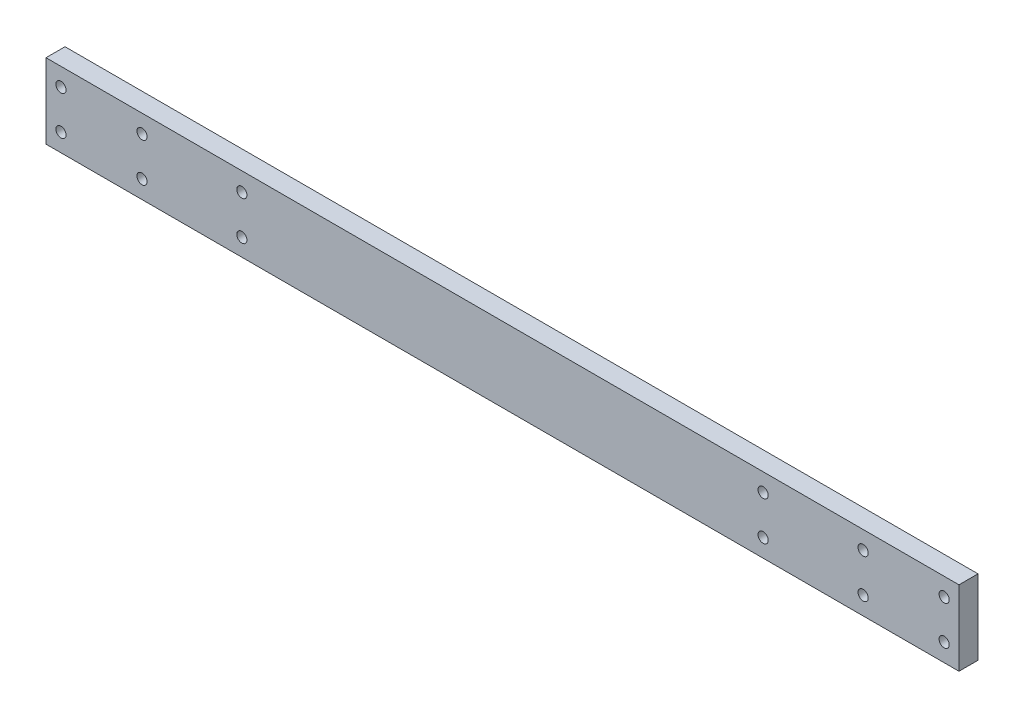
ISO-10303-21;
HEADER;
FILE_DESCRIPTION(('STEP AP214'),'2;1');
FILE_NAME('part.step','',(''),(''),'','','');
FILE_SCHEMA(('AUTOMOTIVE_DESIGN { 1 0 10303 214 1 1 1 1 }'));
ENDSEC;
DATA;
#1=APPLICATION_CONTEXT('core data for automotive mechanical design processes');
#2=APPLICATION_PROTOCOL_DEFINITION('international standard','automotive_design',2000,#1);
#3=PRODUCT_CONTEXT('',#1,'mechanical');
#4=PRODUCT('Part','Part','',(#3));
#5=PRODUCT_RELATED_PRODUCT_CATEGORY('part','',(#4));
#6=PRODUCT_DEFINITION_FORMATION('','',#4);
#7=PRODUCT_DEFINITION_CONTEXT('part definition',#1,'design');
#8=PRODUCT_DEFINITION('design','',#6,#7);
#9=PRODUCT_DEFINITION_SHAPE('','',#8);
#10=(LENGTH_UNIT() NAMED_UNIT(*) SI_UNIT(.MILLI.,.METRE.));
#11=(NAMED_UNIT(*) PLANE_ANGLE_UNIT() SI_UNIT($,.RADIAN.));
#12=(NAMED_UNIT(*) SI_UNIT($,.STERADIAN.) SOLID_ANGLE_UNIT());
#13=UNCERTAINTY_MEASURE_WITH_UNIT(LENGTH_MEASURE(1.E-05),#10,'distance_accuracy_value','');
#14=(GEOMETRIC_REPRESENTATION_CONTEXT(3) GLOBAL_UNCERTAINTY_ASSIGNED_CONTEXT((#13)) GLOBAL_UNIT_ASSIGNED_CONTEXT((#10,
#11,#12)) REPRESENTATION_CONTEXT('',''));
#15=CARTESIAN_POINT('',(0.,0.,0.));
#16=DIRECTION('',(0.,0.,1.));
#17=DIRECTION('',(1.,0.,0.));
#18=AXIS2_PLACEMENT_3D('',#15,#16,#17);
#19=CARTESIAN_POINT('',(264.023766162715,0.,6.35));
#20=DIRECTION('',(1.,0.,0.));
#21=DIRECTION('',(0.,0.,-1.));
#22=AXIS2_PLACEMENT_3D('',#19,#20,#21);
#23=PLANE('',#22);
#24=DIRECTION('',(0.,-1.,0.));
#25=VECTOR('',#24,1.);
#26=CARTESIAN_POINT('',(264.023766162715,0.,0.));
#27=LINE('',#26,#25);
#28=CARTESIAN_POINT('',(264.023766162715,235.923622409626,0.));
#29=VERTEX_POINT('',#28);
#30=CARTESIAN_POINT('',(264.023766162715,210.923622409626,0.));
#31=VERTEX_POINT('',#30);
#32=EDGE_CURVE('E103',#29,#31,#27,.T.);
#33=ORIENTED_EDGE('',*,*,#32,.F.);
#34=DIRECTION('',(0.,0.,-1.));
#35=VECTOR('',#34,1.);
#36=CARTESIAN_POINT('',(264.023766162715,235.923622409626,6.35));
#37=LINE('',#36,#35);
#38=CARTESIAN_POINT('',(264.023766162715,235.923622409626,6.35));
#39=VERTEX_POINT('',#38);
#40=EDGE_CURVE('E11',#39,#29,#37,.T.);
#41=ORIENTED_EDGE('',*,*,#40,.F.);
#42=DIRECTION('',(0.,-1.,0.));
#43=VECTOR('',#42,1.);
#44=CARTESIAN_POINT('',(264.023766162715,0.,6.35));
#45=LINE('',#44,#43);
#46=CARTESIAN_POINT('',(264.023766162715,210.923622409626,6.35));
#47=VERTEX_POINT('',#46);
#48=EDGE_CURVE('E96',#39,#47,#45,.T.);
#49=ORIENTED_EDGE('',*,*,#48,.T.);
#50=DIRECTION('',(0.,0.,-1.));
#51=VECTOR('',#50,1.);
#52=CARTESIAN_POINT('',(264.023766162715,210.923622409626,6.35));
#53=LINE('',#52,#51);
#54=EDGE_CURVE('E76',#47,#31,#53,.T.);
#55=ORIENTED_EDGE('',*,*,#54,.T.);
#56=EDGE_LOOP('',(#33,#41,#49,#55));
#57=FACE_BOUND('',#56,.T.);
#58=ADVANCED_FACE('F36',(#57),#23,.T.);
#59=CARTESIAN_POINT('',(0.,235.923622409626,6.35));
#60=DIRECTION('',(0.,1.,0.));
#61=DIRECTION('',(0.,0.,1.));
#62=AXIS2_PLACEMENT_3D('',#59,#60,#61);
#63=PLANE('',#62);
#64=DIRECTION('',(1.,0.,0.));
#65=VECTOR('',#64,1.);
#66=CARTESIAN_POINT('',(0.,235.923622409626,0.));
#67=LINE('',#66,#65);
#68=CARTESIAN_POINT('',(-40.7762338372855,235.923622409626,0.));
#69=VERTEX_POINT('',#68);
#70=EDGE_CURVE('E89',#69,#29,#67,.T.);
#71=ORIENTED_EDGE('',*,*,#70,.F.);
#72=DIRECTION('',(0.,0.,-1.));
#73=VECTOR('',#72,1.);
#74=CARTESIAN_POINT('',(-40.7762338372855,235.923622409626,6.35));
#75=LINE('',#74,#73);
#76=CARTESIAN_POINT('',(-40.7762338372855,235.923622409626,6.35));
#77=VERTEX_POINT('',#76);
#78=EDGE_CURVE('E45',#77,#69,#75,.T.);
#79=ORIENTED_EDGE('',*,*,#78,.F.);
#80=DIRECTION('',(1.,0.,0.));
#81=VECTOR('',#80,1.);
#82=CARTESIAN_POINT('',(0.,235.923622409626,6.35));
#83=LINE('',#82,#81);
#84=EDGE_CURVE('E87',#77,#39,#83,.T.);
#85=ORIENTED_EDGE('',*,*,#84,.T.);
#86=ORIENTED_EDGE('',*,*,#40,.T.);
#87=EDGE_LOOP('',(#71,#79,#85,#86));
#88=FACE_BOUND('',#87,.T.);
#89=ADVANCED_FACE('F85',(#88),#63,.T.);
#90=CARTESIAN_POINT('',(-40.7762338372855,0.,6.35));
#91=DIRECTION('',(1.,0.,0.));
#92=DIRECTION('',(0.,0.,-1.));
#93=AXIS2_PLACEMENT_3D('',#90,#91,#92);
#94=PLANE('',#93);
#95=DIRECTION('',(0.,-1.,0.));
#96=VECTOR('',#95,1.);
#97=CARTESIAN_POINT('',(-40.7762338372855,0.,0.));
#98=LINE('',#97,#96);
#99=CARTESIAN_POINT('',(-40.7762338372855,210.923622409626,0.));
#100=VERTEX_POINT('',#99);
#101=EDGE_CURVE('E69',#69,#100,#98,.T.);
#102=ORIENTED_EDGE('',*,*,#101,.T.);
#103=DIRECTION('',(0.,0.,-1.));
#104=VECTOR('',#103,1.);
#105=CARTESIAN_POINT('',(-40.7762338372855,210.923622409626,6.35));
#106=LINE('',#105,#104);
#107=CARTESIAN_POINT('',(-40.7762338372855,210.923622409626,6.35));
#108=VERTEX_POINT('',#107);
#109=EDGE_CURVE('E90',#108,#100,#106,.T.);
#110=ORIENTED_EDGE('',*,*,#109,.F.);
#111=DIRECTION('',(0.,-1.,0.));
#112=VECTOR('',#111,1.);
#113=CARTESIAN_POINT('',(-40.7762338372855,0.,6.35));
#114=LINE('',#113,#112);
#115=EDGE_CURVE('E92',#77,#108,#114,.T.);
#116=ORIENTED_EDGE('',*,*,#115,.F.);
#117=ORIENTED_EDGE('',*,*,#78,.T.);
#118=EDGE_LOOP('',(#102,#110,#116,#117));
#119=FACE_BOUND('',#118,.T.);
#120=ADVANCED_FACE('F93',(#119),#94,.F.);
#121=CARTESIAN_POINT('',(0.,210.923622409626,6.35));
#122=DIRECTION('',(0.,1.,0.));
#123=DIRECTION('',(0.,0.,1.));
#124=AXIS2_PLACEMENT_3D('',#121,#122,#123);
#125=PLANE('',#124);
#126=DIRECTION('',(1.,0.,0.));
#127=VECTOR('',#126,1.);
#128=CARTESIAN_POINT('',(0.,210.923622409626,0.));
#129=LINE('',#128,#127);
#130=EDGE_CURVE('E98',#100,#31,#129,.T.);
#131=ORIENTED_EDGE('',*,*,#130,.T.);
#132=ORIENTED_EDGE('',*,*,#54,.F.);
#133=DIRECTION('',(1.,0.,0.));
#134=VECTOR('',#133,1.);
#135=CARTESIAN_POINT('',(0.,210.923622409626,6.35));
#136=LINE('',#135,#134);
#137=EDGE_CURVE('E54',#108,#47,#136,.T.);
#138=ORIENTED_EDGE('',*,*,#137,.F.);
#139=ORIENTED_EDGE('',*,*,#109,.T.);
#140=EDGE_LOOP('',(#131,#132,#138,#139));
#141=FACE_BOUND('',#140,.T.);
#142=ADVANCED_FACE('F182',(#141),#125,.F.);
#143=CARTESIAN_POINT('',(0.,0.,6.35));
#144=DIRECTION('',(0.,0.,1.));
#145=DIRECTION('',(1.,0.,0.));
#146=AXIS2_PLACEMENT_3D('',#143,#144,#145);
#147=PLANE('',#146);
#148=CARTESIAN_POINT('',(198.637476238575,229.923622409726,6.35));
#149=DIRECTION('',(0.,0.,1.));
#150=DIRECTION('',(1.,0.,0.));
#151=AXIS2_PLACEMENT_3D('',#148,#149,#150);
#152=CIRCLE('',#151,1.70000000000001);
#153=CARTESIAN_POINT('',(200.337476238575,229.923622409726,6.35));
#154=VERTEX_POINT('',#153);
#155=EDGE_CURVE('E343',#154,#154,#152,.T.);
#156=ORIENTED_EDGE('',*,*,#155,.F.);
#157=EDGE_LOOP('',(#156));
#158=FACE_BOUND('',#157,.T.);
#159=CARTESIAN_POINT('',(198.637476238575,216.923622409726,6.35));
#160=DIRECTION('',(0.,0.,1.));
#161=DIRECTION('',(1.,0.,0.));
#162=AXIS2_PLACEMENT_3D('',#159,#160,#161);
#163=CIRCLE('',#162,1.70000000000001);
#164=CARTESIAN_POINT('',(200.337476238575,216.923622409726,6.35));
#165=VERTEX_POINT('',#164);
#166=EDGE_CURVE('E344',#165,#165,#163,.T.);
#167=ORIENTED_EDGE('',*,*,#166,.F.);
#168=EDGE_LOOP('',(#167));
#169=FACE_BOUND('',#168,.T.);
#170=CARTESIAN_POINT('',(24.6100560880589,216.7193303143,6.35));
#171=DIRECTION('',(0.,0.,1.));
#172=DIRECTION('',(1.,0.,0.));
#173=AXIS2_PLACEMENT_3D('',#170,#171,#172);
#174=CIRCLE('',#173,1.70000000000001);
#175=CARTESIAN_POINT('',(26.3100560880589,216.7193303143,6.35));
#176=VERTEX_POINT('',#175);
#177=EDGE_CURVE('E346',#176,#176,#174,.T.);
#178=ORIENTED_EDGE('',*,*,#177,.F.);
#179=EDGE_LOOP('',(#178));
#180=FACE_BOUND('',#179,.T.);
#181=CARTESIAN_POINT('',(24.6100560880589,229.7193303143,6.35));
#182=DIRECTION('',(0.,0.,1.));
#183=DIRECTION('',(1.,0.,0.));
#184=AXIS2_PLACEMENT_3D('',#181,#182,#183);
#185=CIRCLE('',#184,1.70000000000001);
#186=CARTESIAN_POINT('',(26.3100560880589,229.7193303143,6.35));
#187=VERTEX_POINT('',#186);
#188=EDGE_CURVE('E140',#187,#187,#185,.T.);
#189=ORIENTED_EDGE('',*,*,#188,.F.);
#190=EDGE_LOOP('',(#189));
#191=FACE_BOUND('',#190,.T.);
#192=CARTESIAN_POINT('',(232.023766162708,216.923622409636,6.35));
#193=DIRECTION('',(0.,0.,1.));
#194=DIRECTION('',(1.,0.,0.));
#195=AXIS2_PLACEMENT_3D('',#192,#193,#194);
#196=CIRCLE('',#195,1.69999999999999);
#197=CARTESIAN_POINT('',(233.723766162708,216.923622409636,6.35));
#198=VERTEX_POINT('',#197);
#199=EDGE_CURVE('E162',#198,#198,#196,.T.);
#200=ORIENTED_EDGE('',*,*,#199,.F.);
#201=EDGE_LOOP('',(#200));
#202=FACE_BOUND('',#201,.T.);
#203=CARTESIAN_POINT('',(-8.72623383728821,229.923622409623,6.35));
#204=DIRECTION('',(0.,0.,1.));
#205=DIRECTION('',(1.,0.,0.));
#206=AXIS2_PLACEMENT_3D('',#203,#204,#205);
#207=CIRCLE('',#206,1.69999999999998);
#208=CARTESIAN_POINT('',(-7.02623383728823,229.923622409623,6.35));
#209=VERTEX_POINT('',#208);
#210=EDGE_CURVE('E164',#209,#209,#207,.T.);
#211=ORIENTED_EDGE('',*,*,#210,.F.);
#212=EDGE_LOOP('',(#211));
#213=FACE_BOUND('',#212,.T.);
#214=CARTESIAN_POINT('',(-35.7762338372891,229.923622409613,6.35));
#215=DIRECTION('',(0.,0.,1.));
#216=DIRECTION('',(1.,0.,0.));
#217=AXIS2_PLACEMENT_3D('',#214,#215,#216);
#218=CIRCLE('',#217,1.69999999999998);
#219=CARTESIAN_POINT('',(-34.0762338372891,229.923622409613,6.35));
#220=VERTEX_POINT('',#219);
#221=EDGE_CURVE('E167',#220,#220,#218,.T.);
#222=ORIENTED_EDGE('',*,*,#221,.F.);
#223=EDGE_LOOP('',(#222));
#224=FACE_BOUND('',#223,.T.);
#225=CARTESIAN_POINT('',(-8.72623383728832,216.923622409623,6.35));
#226=DIRECTION('',(0.,0.,1.));
#227=DIRECTION('',(1.,0.,0.));
#228=AXIS2_PLACEMENT_3D('',#225,#226,#227);
#229=CIRCLE('',#228,1.69999999999998);
#230=CARTESIAN_POINT('',(-7.02623383728834,216.923622409623,6.35));
#231=VERTEX_POINT('',#230);
#232=EDGE_CURVE('E170',#231,#231,#229,.T.);
#233=ORIENTED_EDGE('',*,*,#232,.F.);
#234=EDGE_LOOP('',(#233));
#235=FACE_BOUND('',#234,.T.);
#236=CARTESIAN_POINT('',(259.073766162707,229.923622409642,6.35));
#237=DIRECTION('',(0.,0.,1.));
#238=DIRECTION('',(1.,0.,0.));
#239=AXIS2_PLACEMENT_3D('',#236,#237,#238);
#240=CIRCLE('',#239,1.69999999999996);
#241=CARTESIAN_POINT('',(260.773766162707,229.923622409642,6.35));
#242=VERTEX_POINT('',#241);
#243=EDGE_CURVE('E147',#242,#242,#240,.T.);
#244=ORIENTED_EDGE('',*,*,#243,.F.);
#245=EDGE_LOOP('',(#244));
#246=FACE_BOUND('',#245,.T.);
#247=CARTESIAN_POINT('',(259.073766162707,216.923622409642,6.35));
#248=DIRECTION('',(0.,0.,1.));
#249=DIRECTION('',(1.,0.,0.));
#250=AXIS2_PLACEMENT_3D('',#247,#248,#249);
#251=CIRCLE('',#250,1.69999999999996);
#252=CARTESIAN_POINT('',(260.773766162707,216.923622409642,6.35));
#253=VERTEX_POINT('',#252);
#254=EDGE_CURVE('E151',#253,#253,#251,.T.);
#255=ORIENTED_EDGE('',*,*,#254,.F.);
#256=EDGE_LOOP('',(#255));
#257=FACE_BOUND('',#256,.T.);
#258=CARTESIAN_POINT('',(232.023766162708,229.923622409636,6.35));
#259=DIRECTION('',(0.,0.,1.));
#260=DIRECTION('',(1.,0.,0.));
#261=AXIS2_PLACEMENT_3D('',#258,#259,#260);
#262=CIRCLE('',#261,1.69999999999999);
#263=CARTESIAN_POINT('',(233.723766162708,229.923622409636,6.35));
#264=VERTEX_POINT('',#263);
#265=EDGE_CURVE('E156',#264,#264,#262,.T.);
#266=ORIENTED_EDGE('',*,*,#265,.F.);
#267=EDGE_LOOP('',(#266));
#268=FACE_BOUND('',#267,.T.);
#269=CARTESIAN_POINT('',(-35.7762338372892,216.923622409613,6.35));
#270=DIRECTION('',(0.,0.,1.));
#271=DIRECTION('',(1.,0.,0.));
#272=AXIS2_PLACEMENT_3D('',#269,#270,#271);
#273=CIRCLE('',#272,1.69999999999998);
#274=CARTESIAN_POINT('',(-34.0762338372892,216.923622409613,6.35));
#275=VERTEX_POINT('',#274);
#276=EDGE_CURVE('E116',#275,#275,#273,.T.);
#277=ORIENTED_EDGE('',*,*,#276,.F.);
#278=EDGE_LOOP('',(#277));
#279=FACE_BOUND('',#278,.T.);
#280=ORIENTED_EDGE('',*,*,#48,.F.);
#281=ORIENTED_EDGE('',*,*,#84,.F.);
#282=ORIENTED_EDGE('',*,*,#115,.T.);
#283=ORIENTED_EDGE('',*,*,#137,.T.);
#284=EDGE_LOOP('',(#280,#281,#282,#283));
#285=FACE_BOUND('',#284,.T.);
#286=ADVANCED_FACE('F95',(#158,#169,#180,#191,#202,#213,#224,#235,#246,#257,#268,#279,#285),
#147,.T.);
#287=CARTESIAN_POINT('',(0.,0.,0.));
#288=DIRECTION('',(0.,0.,1.));
#289=DIRECTION('',(1.,0.,0.));
#290=AXIS2_PLACEMENT_3D('',#287,#288,#289);
#291=PLANE('',#290);
#292=CARTESIAN_POINT('',(198.637476238575,229.923622409726,0.));
#293=DIRECTION('',(0.,0.,1.));
#294=DIRECTION('',(1.,0.,0.));
#295=AXIS2_PLACEMENT_3D('',#292,#293,#294);
#296=CIRCLE('',#295,1.70000000000001);
#297=CARTESIAN_POINT('',(200.337476238575,229.923622409726,0.));
#298=VERTEX_POINT('',#297);
#299=EDGE_CURVE('E39',#298,#298,#296,.T.);
#300=ORIENTED_EDGE('',*,*,#299,.T.);
#301=EDGE_LOOP('',(#300));
#302=FACE_BOUND('',#301,.T.);
#303=CARTESIAN_POINT('',(198.637476238575,216.923622409726,0.));
#304=DIRECTION('',(0.,0.,1.));
#305=DIRECTION('',(1.,0.,0.));
#306=AXIS2_PLACEMENT_3D('',#303,#304,#305);
#307=CIRCLE('',#306,1.70000000000001);
#308=CARTESIAN_POINT('',(200.337476238575,216.923622409726,0.));
#309=VERTEX_POINT('',#308);
#310=EDGE_CURVE('E142',#309,#309,#307,.T.);
#311=ORIENTED_EDGE('',*,*,#310,.T.);
#312=EDGE_LOOP('',(#311));
#313=FACE_BOUND('',#312,.T.);
#314=CARTESIAN_POINT('',(24.6100560880589,216.7193303143,0.));
#315=DIRECTION('',(0.,0.,1.));
#316=DIRECTION('',(1.,0.,0.));
#317=AXIS2_PLACEMENT_3D('',#314,#315,#316);
#318=CIRCLE('',#317,1.70000000000001);
#319=CARTESIAN_POINT('',(26.3100560880589,216.7193303143,0.));
#320=VERTEX_POINT('',#319);
#321=EDGE_CURVE('E139',#320,#320,#318,.T.);
#322=ORIENTED_EDGE('',*,*,#321,.T.);
#323=EDGE_LOOP('',(#322));
#324=FACE_BOUND('',#323,.T.);
#325=CARTESIAN_POINT('',(24.6100560880589,229.7193303143,0.));
#326=DIRECTION('',(0.,0.,1.));
#327=DIRECTION('',(1.,0.,0.));
#328=AXIS2_PLACEMENT_3D('',#325,#326,#327);
#329=CIRCLE('',#328,1.70000000000001);
#330=CARTESIAN_POINT('',(26.3100560880589,229.7193303143,0.));
#331=VERTEX_POINT('',#330);
#332=EDGE_CURVE('E136',#331,#331,#329,.T.);
#333=ORIENTED_EDGE('',*,*,#332,.T.);
#334=EDGE_LOOP('',(#333));
#335=FACE_BOUND('',#334,.T.);
#336=CARTESIAN_POINT('',(232.023766162708,216.923622409636,0.));
#337=DIRECTION('',(0.,0.,1.));
#338=DIRECTION('',(1.,0.,0.));
#339=AXIS2_PLACEMENT_3D('',#336,#337,#338);
#340=CIRCLE('',#339,1.69999999999999);
#341=CARTESIAN_POINT('',(233.723766162708,216.923622409636,0.));
#342=VERTEX_POINT('',#341);
#343=EDGE_CURVE('E106',#342,#342,#340,.T.);
#344=ORIENTED_EDGE('',*,*,#343,.T.);
#345=EDGE_LOOP('',(#344));
#346=FACE_BOUND('',#345,.T.);
#347=CARTESIAN_POINT('',(-8.72623383728821,229.923622409623,0.));
#348=DIRECTION('',(0.,0.,1.));
#349=DIRECTION('',(1.,0.,0.));
#350=AXIS2_PLACEMENT_3D('',#347,#348,#349);
#351=CIRCLE('',#350,1.69999999999998);
#352=CARTESIAN_POINT('',(-7.02623383728823,229.923622409623,0.));
#353=VERTEX_POINT('',#352);
#354=EDGE_CURVE('E131',#353,#353,#351,.T.);
#355=ORIENTED_EDGE('',*,*,#354,.T.);
#356=EDGE_LOOP('',(#355));
#357=FACE_BOUND('',#356,.T.);
#358=CARTESIAN_POINT('',(-35.7762338372891,229.923622409613,0.));
#359=DIRECTION('',(0.,0.,1.));
#360=DIRECTION('',(1.,0.,0.));
#361=AXIS2_PLACEMENT_3D('',#358,#359,#360);
#362=CIRCLE('',#361,1.69999999999998);
#363=CARTESIAN_POINT('',(-34.0762338372891,229.923622409613,0.));
#364=VERTEX_POINT('',#363);
#365=EDGE_CURVE('E128',#364,#364,#362,.T.);
#366=ORIENTED_EDGE('',*,*,#365,.T.);
#367=EDGE_LOOP('',(#366));
#368=FACE_BOUND('',#367,.T.);
#369=CARTESIAN_POINT('',(-8.72623383728832,216.923622409623,0.));
#370=DIRECTION('',(0.,0.,1.));
#371=DIRECTION('',(1.,0.,0.));
#372=AXIS2_PLACEMENT_3D('',#369,#370,#371);
#373=CIRCLE('',#372,1.69999999999998);
#374=CARTESIAN_POINT('',(-7.02623383728834,216.923622409623,0.));
#375=VERTEX_POINT('',#374);
#376=EDGE_CURVE('E125',#375,#375,#373,.T.);
#377=ORIENTED_EDGE('',*,*,#376,.T.);
#378=EDGE_LOOP('',(#377));
#379=FACE_BOUND('',#378,.T.);
#380=CARTESIAN_POINT('',(259.073766162707,229.923622409642,0.));
#381=DIRECTION('',(0.,0.,1.));
#382=DIRECTION('',(1.,0.,0.));
#383=AXIS2_PLACEMENT_3D('',#380,#381,#382);
#384=CIRCLE('',#383,1.69999999999996);
#385=CARTESIAN_POINT('',(260.773766162707,229.923622409642,0.));
#386=VERTEX_POINT('',#385);
#387=EDGE_CURVE('E122',#386,#386,#384,.T.);
#388=ORIENTED_EDGE('',*,*,#387,.T.);
#389=EDGE_LOOP('',(#388));
#390=FACE_BOUND('',#389,.T.);
#391=CARTESIAN_POINT('',(259.073766162707,216.923622409642,0.));
#392=DIRECTION('',(0.,0.,1.));
#393=DIRECTION('',(1.,0.,0.));
#394=AXIS2_PLACEMENT_3D('',#391,#392,#393);
#395=CIRCLE('',#394,1.69999999999996);
#396=CARTESIAN_POINT('',(260.773766162707,216.923622409642,0.));
#397=VERTEX_POINT('',#396);
#398=EDGE_CURVE('E119',#397,#397,#395,.T.);
#399=ORIENTED_EDGE('',*,*,#398,.T.);
#400=EDGE_LOOP('',(#399));
#401=FACE_BOUND('',#400,.T.);
#402=CARTESIAN_POINT('',(232.023766162708,229.923622409636,0.));
#403=DIRECTION('',(0.,0.,1.));
#404=DIRECTION('',(1.,0.,0.));
#405=AXIS2_PLACEMENT_3D('',#402,#403,#404);
#406=CIRCLE('',#405,1.69999999999999);
#407=CARTESIAN_POINT('',(233.723766162708,229.923622409636,0.));
#408=VERTEX_POINT('',#407);
#409=EDGE_CURVE('E115',#408,#408,#406,.T.);
#410=ORIENTED_EDGE('',*,*,#409,.T.);
#411=EDGE_LOOP('',(#410));
#412=FACE_BOUND('',#411,.T.);
#413=CARTESIAN_POINT('',(-35.7762338372892,216.923622409613,0.));
#414=DIRECTION('',(0.,0.,1.));
#415=DIRECTION('',(1.,0.,0.));
#416=AXIS2_PLACEMENT_3D('',#413,#414,#415);
#417=CIRCLE('',#416,1.69999999999998);
#418=CARTESIAN_POINT('',(-34.0762338372892,216.923622409613,0.));
#419=VERTEX_POINT('',#418);
#420=EDGE_CURVE('E112',#419,#419,#417,.T.);
#421=ORIENTED_EDGE('',*,*,#420,.T.);
#422=EDGE_LOOP('',(#421));
#423=FACE_BOUND('',#422,.T.);
#424=ORIENTED_EDGE('',*,*,#32,.T.);
#425=ORIENTED_EDGE('',*,*,#130,.F.);
#426=ORIENTED_EDGE('',*,*,#101,.F.);
#427=ORIENTED_EDGE('',*,*,#70,.T.);
#428=EDGE_LOOP('',(#424,#425,#426,#427));
#429=FACE_BOUND('',#428,.T.);
#430=ADVANCED_FACE('F181',(#302,#313,#324,#335,#346,#357,#368,#379,#390,#401,#412,#423,#429),
#291,.F.);
#431=CARTESIAN_POINT('',(-35.7762338372892,216.923622409613,-3.65));
#432=DIRECTION('',(0.,0.,1.));
#433=DIRECTION('',(1.,0.,0.));
#434=AXIS2_PLACEMENT_3D('',#431,#432,#433);
#435=CYLINDRICAL_SURFACE('',#434,1.69999999999998);
#436=ORIENTED_EDGE('',*,*,#276,.T.);
#437=EDGE_LOOP('',(#436));
#438=FACE_BOUND('',#437,.T.);
#439=ORIENTED_EDGE('',*,*,#420,.F.);
#440=EDGE_LOOP('',(#439));
#441=FACE_BOUND('',#440,.T.);
#442=ADVANCED_FACE('F177',(#438,#441),#435,.F.);
#443=CARTESIAN_POINT('',(232.023766162708,229.923622409636,-3.65));
#444=DIRECTION('',(0.,0.,1.));
#445=DIRECTION('',(1.,0.,0.));
#446=AXIS2_PLACEMENT_3D('',#443,#444,#445);
#447=CYLINDRICAL_SURFACE('',#446,1.69999999999999);
#448=ORIENTED_EDGE('',*,*,#265,.T.);
#449=EDGE_LOOP('',(#448));
#450=FACE_BOUND('',#449,.T.);
#451=ORIENTED_EDGE('',*,*,#409,.F.);
#452=EDGE_LOOP('',(#451));
#453=FACE_BOUND('',#452,.T.);
#454=ADVANCED_FACE('F221',(#450,#453),#447,.F.);
#455=CARTESIAN_POINT('',(259.073766162707,216.923622409642,-3.65));
#456=DIRECTION('',(0.,0.,1.));
#457=DIRECTION('',(1.,0.,0.));
#458=AXIS2_PLACEMENT_3D('',#455,#456,#457);
#459=CYLINDRICAL_SURFACE('',#458,1.69999999999996);
#460=ORIENTED_EDGE('',*,*,#254,.T.);
#461=EDGE_LOOP('',(#460));
#462=FACE_BOUND('',#461,.T.);
#463=ORIENTED_EDGE('',*,*,#398,.F.);
#464=EDGE_LOOP('',(#463));
#465=FACE_BOUND('',#464,.T.);
#466=ADVANCED_FACE('F230',(#462,#465),#459,.F.);
#467=CARTESIAN_POINT('',(259.073766162707,229.923622409642,-3.65));
#468=DIRECTION('',(0.,0.,1.));
#469=DIRECTION('',(1.,0.,0.));
#470=AXIS2_PLACEMENT_3D('',#467,#468,#469);
#471=CYLINDRICAL_SURFACE('',#470,1.69999999999996);
#472=ORIENTED_EDGE('',*,*,#243,.T.);
#473=EDGE_LOOP('',(#472));
#474=FACE_BOUND('',#473,.T.);
#475=ORIENTED_EDGE('',*,*,#387,.F.);
#476=EDGE_LOOP('',(#475));
#477=FACE_BOUND('',#476,.T.);
#478=ADVANCED_FACE('F240',(#474,#477),#471,.F.);
#479=CARTESIAN_POINT('',(-8.72623383728832,216.923622409623,-3.65));
#480=DIRECTION('',(0.,0.,1.));
#481=DIRECTION('',(1.,0.,0.));
#482=AXIS2_PLACEMENT_3D('',#479,#480,#481);
#483=CYLINDRICAL_SURFACE('',#482,1.69999999999998);
#484=ORIENTED_EDGE('',*,*,#232,.T.);
#485=EDGE_LOOP('',(#484));
#486=FACE_BOUND('',#485,.T.);
#487=ORIENTED_EDGE('',*,*,#376,.F.);
#488=EDGE_LOOP('',(#487));
#489=FACE_BOUND('',#488,.T.);
#490=ADVANCED_FACE('F250',(#486,#489),#483,.F.);
#491=CARTESIAN_POINT('',(-35.7762338372891,229.923622409613,-3.65));
#492=DIRECTION('',(0.,0.,1.));
#493=DIRECTION('',(1.,0.,0.));
#494=AXIS2_PLACEMENT_3D('',#491,#492,#493);
#495=CYLINDRICAL_SURFACE('',#494,1.69999999999998);
#496=ORIENTED_EDGE('',*,*,#221,.T.);
#497=EDGE_LOOP('',(#496));
#498=FACE_BOUND('',#497,.T.);
#499=ORIENTED_EDGE('',*,*,#365,.F.);
#500=EDGE_LOOP('',(#499));
#501=FACE_BOUND('',#500,.T.);
#502=ADVANCED_FACE('F259',(#498,#501),#495,.F.);
#503=CARTESIAN_POINT('',(-8.72623383728821,229.923622409623,-3.65));
#504=DIRECTION('',(0.,0.,1.));
#505=DIRECTION('',(1.,0.,0.));
#506=AXIS2_PLACEMENT_3D('',#503,#504,#505);
#507=CYLINDRICAL_SURFACE('',#506,1.69999999999998);
#508=ORIENTED_EDGE('',*,*,#210,.T.);
#509=EDGE_LOOP('',(#508));
#510=FACE_BOUND('',#509,.T.);
#511=ORIENTED_EDGE('',*,*,#354,.F.);
#512=EDGE_LOOP('',(#511));
#513=FACE_BOUND('',#512,.T.);
#514=ADVANCED_FACE('F269',(#510,#513),#507,.F.);
#515=CARTESIAN_POINT('',(232.023766162708,216.923622409636,-3.65));
#516=DIRECTION('',(0.,0.,1.));
#517=DIRECTION('',(1.,0.,0.));
#518=AXIS2_PLACEMENT_3D('',#515,#516,#517);
#519=CYLINDRICAL_SURFACE('',#518,1.69999999999999);
#520=ORIENTED_EDGE('',*,*,#199,.T.);
#521=EDGE_LOOP('',(#520));
#522=FACE_BOUND('',#521,.T.);
#523=ORIENTED_EDGE('',*,*,#343,.F.);
#524=EDGE_LOOP('',(#523));
#525=FACE_BOUND('',#524,.T.);
#526=ADVANCED_FACE('F279',(#522,#525),#519,.F.);
#527=CARTESIAN_POINT('',(24.6100560880589,229.7193303143,-14.65));
#528=DIRECTION('',(0.,0.,1.));
#529=DIRECTION('',(1.,0.,0.));
#530=AXIS2_PLACEMENT_3D('',#527,#528,#529);
#531=CYLINDRICAL_SURFACE('',#530,1.70000000000001);
#532=CARTESIAN_POINT('',(26.3100560880589,229.7193303143,6.35));
#533=CARTESIAN_POINT('',(26.3100560880589,229.7193303143,6.28385416666667));
#534=CARTESIAN_POINT('',(26.3100560880589,229.7193303143,6.21770833333333));
#535=CARTESIAN_POINT('',(26.3100560880589,229.7193303143,6.08541666666667));
#536=CARTESIAN_POINT('',(26.3100560880589,229.7193303143,6.01927083333333));
#537=CARTESIAN_POINT('',(26.3100560880589,229.7193303143,5.88697916666667));
#538=CARTESIAN_POINT('',(26.3100560880589,229.7193303143,5.82083333333333));
#539=CARTESIAN_POINT('',(26.3100560880589,229.7193303143,5.68854166666667));
#540=CARTESIAN_POINT('',(26.3100560880589,229.7193303143,5.62239583333333));
#541=CARTESIAN_POINT('',(26.3100560880589,229.7193303143,5.49010416666667));
#542=CARTESIAN_POINT('',(26.3100560880589,229.7193303143,5.42395833333333));
#543=CARTESIAN_POINT('',(26.3100560880589,229.7193303143,5.29166666666667));
#544=CARTESIAN_POINT('',(26.3100560880589,229.7193303143,5.22552083333333));
#545=CARTESIAN_POINT('',(26.3100560880589,229.7193303143,5.09322916666667));
#546=CARTESIAN_POINT('',(26.3100560880589,229.7193303143,5.02708333333333));
#547=CARTESIAN_POINT('',(26.3100560880589,229.7193303143,4.89479166666667));
#548=CARTESIAN_POINT('',(26.3100560880589,229.7193303143,4.82864583333333));
#549=CARTESIAN_POINT('',(26.3100560880589,229.7193303143,4.69635416666667));
#550=CARTESIAN_POINT('',(26.3100560880589,229.7193303143,4.63020833333333));
#551=CARTESIAN_POINT('',(26.3100560880589,229.7193303143,4.49791666666667));
#552=CARTESIAN_POINT('',(26.3100560880589,229.7193303143,4.43177083333333));
#553=CARTESIAN_POINT('',(26.3100560880589,229.7193303143,4.29947916666667));
#554=CARTESIAN_POINT('',(26.3100560880589,229.7193303143,4.23333333333333));
#555=CARTESIAN_POINT('',(26.3100560880589,229.7193303143,4.10104166666667));
#556=CARTESIAN_POINT('',(26.3100560880589,229.7193303143,4.03489583333333));
#557=CARTESIAN_POINT('',(26.3100560880589,229.7193303143,3.90260416666667));
#558=CARTESIAN_POINT('',(26.3100560880589,229.7193303143,3.83645833333333));
#559=CARTESIAN_POINT('',(26.3100560880589,229.7193303143,3.70416666666667));
#560=CARTESIAN_POINT('',(26.3100560880589,229.7193303143,3.63802083333333));
#561=CARTESIAN_POINT('',(26.3100560880589,229.7193303143,3.50572916666667));
#562=CARTESIAN_POINT('',(26.3100560880589,229.7193303143,3.43958333333333));
#563=CARTESIAN_POINT('',(26.3100560880589,229.7193303143,3.30729166666667));
#564=CARTESIAN_POINT('',(26.3100560880589,229.7193303143,3.24114583333333));
#565=CARTESIAN_POINT('',(26.3100560880589,229.7193303143,3.10885416666667));
#566=CARTESIAN_POINT('',(26.3100560880589,229.7193303143,3.04270833333333));
#567=CARTESIAN_POINT('',(26.3100560880589,229.7193303143,2.91041666666667));
#568=CARTESIAN_POINT('',(26.3100560880589,229.7193303143,2.84427083333333));
#569=CARTESIAN_POINT('',(26.3100560880589,229.7193303143,2.71197916666666));
#570=CARTESIAN_POINT('',(26.3100560880589,229.7193303143,2.64583333333333));
#571=CARTESIAN_POINT('',(26.3100560880589,229.7193303143,2.51354166666667));
#572=CARTESIAN_POINT('',(26.3100560880589,229.7193303143,2.44739583333333));
#573=CARTESIAN_POINT('',(26.3100560880589,229.7193303143,2.31510416666667));
#574=CARTESIAN_POINT('',(26.3100560880589,229.7193303143,2.24895833333333));
#575=CARTESIAN_POINT('',(26.3100560880589,229.7193303143,2.11666666666666));
#576=CARTESIAN_POINT('',(26.3100560880589,229.7193303143,2.05052083333333));
#577=CARTESIAN_POINT('',(26.3100560880589,229.7193303143,1.91822916666667));
#578=CARTESIAN_POINT('',(26.3100560880589,229.7193303143,1.85208333333333));
#579=CARTESIAN_POINT('',(26.3100560880589,229.7193303143,1.71979166666667));
#580=CARTESIAN_POINT('',(26.3100560880589,229.7193303143,1.65364583333333));
#581=CARTESIAN_POINT('',(26.3100560880589,229.7193303143,1.52135416666666));
#582=CARTESIAN_POINT('',(26.3100560880589,229.7193303143,1.45520833333333));
#583=CARTESIAN_POINT('',(26.3100560880589,229.7193303143,1.32291666666666));
#584=CARTESIAN_POINT('',(26.3100560880589,229.7193303143,1.25677083333333));
#585=CARTESIAN_POINT('',(26.3100560880589,229.7193303143,1.12447916666666));
#586=CARTESIAN_POINT('',(26.3100560880589,229.7193303143,1.05833333333333));
#587=CARTESIAN_POINT('',(26.3100560880589,229.7193303143,0.926041666666664));
#588=CARTESIAN_POINT('',(26.3100560880589,229.7193303143,0.859895833333332));
#589=CARTESIAN_POINT('',(26.3100560880589,229.7193303143,0.727604166666666));
#590=CARTESIAN_POINT('',(26.3100560880589,229.7193303143,0.661458333333333));
#591=CARTESIAN_POINT('',(26.3100560880589,229.7193303143,0.529166666666667));
#592=CARTESIAN_POINT('',(26.3100560880589,229.7193303143,0.463020833333333));
#593=CARTESIAN_POINT('',(26.3100560880589,229.7193303143,0.330729166666666));
#594=CARTESIAN_POINT('',(26.3100560880589,229.7193303143,0.264583333333333));
#595=CARTESIAN_POINT('',(26.3100560880589,229.7193303143,0.132291666666666));
#596=CARTESIAN_POINT('',(26.3100560880589,229.7193303143,0.066145833333333));
#597=CARTESIAN_POINT('',(26.3100560880589,229.7193303143,0.));
#598=B_SPLINE_CURVE_WITH_KNOTS('',3,(#532,#533,#534,#535,#536,#537,#538,#539,#540,#541,#542,
#543,#544,#545,#546,#547,#548,#549,#550,#551,#552,#553,#554,#555,#556,#557,#558,#559,#560,#561,
#562,#563,#564,#565,#566,#567,#568,#569,#570,#571,#572,#573,#574,#575,#576,#577,#578,#579,#580,
#581,#582,#583,#584,#585,#586,#587,#588,#589,#590,#591,#592,#593,#594,#595,#596,#597),
.UNSPECIFIED.,.F.,.F.,(4,2,2,2,2,2,2,2,2,2,2,2,2,2,2,2,2,2,2,2,2,2,2,2,2,2,2,2,2,2,2,2,4),(0.,
0.198437499999999,0.396875000000001,0.5953125,0.793749999999999,0.992187500000002,1.190625,
1.3890625,1.5875,1.7859375,1.984375,2.1828125,2.38125,2.5796875,2.778125,2.9765625,3.175,
3.3734375,3.571875,3.7703125,3.96875,4.1671875,4.365625,4.5640625,4.7625,4.9609375,5.159375,
5.3578125,5.55625,5.7546875,5.953125,6.1515625,6.35),.UNSPECIFIED.);
#599=EDGE_CURVE('BSEAM288',#187,#331,#598,.T.);
#600=ORIENTED_EDGE('',*,*,#188,.T.);
#601=ORIENTED_EDGE('',*,*,#332,.F.);
#602=ORIENTED_EDGE('',*,*,#599,.T.);
#603=ORIENTED_EDGE('',*,*,#599,.F.);
#604=EDGE_LOOP('',(#600,#602,#601,#603));
#605=FACE_BOUND('',#604,.T.);
#606=ADVANCED_FACE('F288',(#605),#531,.F.);
#607=CARTESIAN_POINT('',(24.6100560880589,216.7193303143,-14.65));
#608=DIRECTION('',(0.,0.,1.));
#609=DIRECTION('',(1.,0.,0.));
#610=AXIS2_PLACEMENT_3D('',#607,#608,#609);
#611=CYLINDRICAL_SURFACE('',#610,1.70000000000001);
#612=CARTESIAN_POINT('',(26.3100560880589,216.7193303143,6.35));
#613=CARTESIAN_POINT('',(26.3100560880589,216.7193303143,6.28385416666667));
#614=CARTESIAN_POINT('',(26.3100560880589,216.7193303143,6.21770833333333));
#615=CARTESIAN_POINT('',(26.3100560880589,216.7193303143,6.08541666666667));
#616=CARTESIAN_POINT('',(26.3100560880589,216.7193303143,6.01927083333333));
#617=CARTESIAN_POINT('',(26.3100560880589,216.7193303143,5.88697916666667));
#618=CARTESIAN_POINT('',(26.3100560880589,216.7193303143,5.82083333333333));
#619=CARTESIAN_POINT('',(26.3100560880589,216.7193303143,5.68854166666667));
#620=CARTESIAN_POINT('',(26.3100560880589,216.7193303143,5.62239583333333));
#621=CARTESIAN_POINT('',(26.3100560880589,216.7193303143,5.49010416666667));
#622=CARTESIAN_POINT('',(26.3100560880589,216.7193303143,5.42395833333333));
#623=CARTESIAN_POINT('',(26.3100560880589,216.7193303143,5.29166666666667));
#624=CARTESIAN_POINT('',(26.3100560880589,216.7193303143,5.22552083333333));
#625=CARTESIAN_POINT('',(26.3100560880589,216.7193303143,5.09322916666667));
#626=CARTESIAN_POINT('',(26.3100560880589,216.7193303143,5.02708333333333));
#627=CARTESIAN_POINT('',(26.3100560880589,216.7193303143,4.89479166666667));
#628=CARTESIAN_POINT('',(26.3100560880589,216.7193303143,4.82864583333333));
#629=CARTESIAN_POINT('',(26.3100560880589,216.7193303143,4.69635416666667));
#630=CARTESIAN_POINT('',(26.3100560880589,216.7193303143,4.63020833333333));
#631=CARTESIAN_POINT('',(26.3100560880589,216.7193303143,4.49791666666667));
#632=CARTESIAN_POINT('',(26.3100560880589,216.7193303143,4.43177083333333));
#633=CARTESIAN_POINT('',(26.3100560880589,216.7193303143,4.29947916666667));
#634=CARTESIAN_POINT('',(26.3100560880589,216.7193303143,4.23333333333333));
#635=CARTESIAN_POINT('',(26.3100560880589,216.7193303143,4.10104166666667));
#636=CARTESIAN_POINT('',(26.3100560880589,216.7193303143,4.03489583333333));
#637=CARTESIAN_POINT('',(26.3100560880589,216.7193303143,3.90260416666667));
#638=CARTESIAN_POINT('',(26.3100560880589,216.7193303143,3.83645833333333));
#639=CARTESIAN_POINT('',(26.3100560880589,216.7193303143,3.70416666666667));
#640=CARTESIAN_POINT('',(26.3100560880589,216.7193303143,3.63802083333333));
#641=CARTESIAN_POINT('',(26.3100560880589,216.7193303143,3.50572916666667));
#642=CARTESIAN_POINT('',(26.3100560880589,216.7193303143,3.43958333333333));
#643=CARTESIAN_POINT('',(26.3100560880589,216.7193303143,3.30729166666667));
#644=CARTESIAN_POINT('',(26.3100560880589,216.7193303143,3.24114583333333));
#645=CARTESIAN_POINT('',(26.3100560880589,216.7193303143,3.10885416666667));
#646=CARTESIAN_POINT('',(26.3100560880589,216.7193303143,3.04270833333333));
#647=CARTESIAN_POINT('',(26.3100560880589,216.7193303143,2.91041666666667));
#648=CARTESIAN_POINT('',(26.3100560880589,216.7193303143,2.84427083333333));
#649=CARTESIAN_POINT('',(26.3100560880589,216.7193303143,2.71197916666666));
#650=CARTESIAN_POINT('',(26.3100560880589,216.7193303143,2.64583333333333));
#651=CARTESIAN_POINT('',(26.3100560880589,216.7193303143,2.51354166666667));
#652=CARTESIAN_POINT('',(26.3100560880589,216.7193303143,2.44739583333333));
#653=CARTESIAN_POINT('',(26.3100560880589,216.7193303143,2.31510416666667));
#654=CARTESIAN_POINT('',(26.3100560880589,216.7193303143,2.24895833333333));
#655=CARTESIAN_POINT('',(26.3100560880589,216.7193303143,2.11666666666666));
#656=CARTESIAN_POINT('',(26.3100560880589,216.7193303143,2.05052083333333));
#657=CARTESIAN_POINT('',(26.3100560880589,216.7193303143,1.91822916666667));
#658=CARTESIAN_POINT('',(26.3100560880589,216.7193303143,1.85208333333333));
#659=CARTESIAN_POINT('',(26.3100560880589,216.7193303143,1.71979166666667));
#660=CARTESIAN_POINT('',(26.3100560880589,216.7193303143,1.65364583333333));
#661=CARTESIAN_POINT('',(26.3100560880589,216.7193303143,1.52135416666666));
#662=CARTESIAN_POINT('',(26.3100560880589,216.7193303143,1.45520833333333));
#663=CARTESIAN_POINT('',(26.3100560880589,216.7193303143,1.32291666666666));
#664=CARTESIAN_POINT('',(26.3100560880589,216.7193303143,1.25677083333333));
#665=CARTESIAN_POINT('',(26.3100560880589,216.7193303143,1.12447916666666));
#666=CARTESIAN_POINT('',(26.3100560880589,216.7193303143,1.05833333333333));
#667=CARTESIAN_POINT('',(26.3100560880589,216.7193303143,0.926041666666664));
#668=CARTESIAN_POINT('',(26.3100560880589,216.7193303143,0.859895833333332));
#669=CARTESIAN_POINT('',(26.3100560880589,216.7193303143,0.727604166666666));
#670=CARTESIAN_POINT('',(26.3100560880589,216.7193303143,0.661458333333333));
#671=CARTESIAN_POINT('',(26.3100560880589,216.7193303143,0.529166666666667));
#672=CARTESIAN_POINT('',(26.3100560880589,216.7193303143,0.463020833333333));
#673=CARTESIAN_POINT('',(26.3100560880589,216.7193303143,0.330729166666666));
#674=CARTESIAN_POINT('',(26.3100560880589,216.7193303143,0.264583333333333));
#675=CARTESIAN_POINT('',(26.3100560880589,216.7193303143,0.132291666666666));
#676=CARTESIAN_POINT('',(26.3100560880589,216.7193303143,0.066145833333333));
#677=CARTESIAN_POINT('',(26.3100560880589,216.7193303143,0.));
#678=B_SPLINE_CURVE_WITH_KNOTS('',3,(#612,#613,#614,#615,#616,#617,#618,#619,#620,#621,#622,
#623,#624,#625,#626,#627,#628,#629,#630,#631,#632,#633,#634,#635,#636,#637,#638,#639,#640,#641,
#642,#643,#644,#645,#646,#647,#648,#649,#650,#651,#652,#653,#654,#655,#656,#657,#658,#659,#660,
#661,#662,#663,#664,#665,#666,#667,#668,#669,#670,#671,#672,#673,#674,#675,#676,#677),
.UNSPECIFIED.,.F.,.F.,(4,2,2,2,2,2,2,2,2,2,2,2,2,2,2,2,2,2,2,2,2,2,2,2,2,2,2,2,2,2,2,2,4),(0.,
0.198437499999999,0.396875000000001,0.5953125,0.793749999999999,0.992187500000002,1.190625,
1.3890625,1.5875,1.7859375,1.984375,2.1828125,2.38125,2.5796875,2.778125,2.9765625,3.175,
3.3734375,3.571875,3.7703125,3.96875,4.1671875,4.365625,4.5640625,4.7625,4.9609375,5.159375,
5.3578125,5.55625,5.7546875,5.953125,6.1515625,6.35),.UNSPECIFIED.);
#679=EDGE_CURVE('BSEAM307',#176,#320,#678,.T.);
#680=ORIENTED_EDGE('',*,*,#177,.T.);
#681=ORIENTED_EDGE('',*,*,#321,.F.);
#682=ORIENTED_EDGE('',*,*,#679,.T.);
#683=ORIENTED_EDGE('',*,*,#679,.F.);
#684=EDGE_LOOP('',(#680,#682,#681,#683));
#685=FACE_BOUND('',#684,.T.);
#686=ADVANCED_FACE('F307',(#685),#611,.F.);
#687=CARTESIAN_POINT('',(198.637476238575,216.923622409726,-14.65));
#688=DIRECTION('',(0.,0.,1.));
#689=DIRECTION('',(1.,0.,0.));
#690=AXIS2_PLACEMENT_3D('',#687,#688,#689);
#691=CYLINDRICAL_SURFACE('',#690,1.70000000000001);
#692=CARTESIAN_POINT('',(200.337476238575,216.923622409726,6.35));
#693=CARTESIAN_POINT('',(200.337476238575,216.923622409726,6.28385416666667));
#694=CARTESIAN_POINT('',(200.337476238575,216.923622409726,6.21770833333333));
#695=CARTESIAN_POINT('',(200.337476238575,216.923622409726,6.08541666666667));
#696=CARTESIAN_POINT('',(200.337476238575,216.923622409726,6.01927083333333));
#697=CARTESIAN_POINT('',(200.337476238575,216.923622409726,5.88697916666667));
#698=CARTESIAN_POINT('',(200.337476238575,216.923622409726,5.82083333333333));
#699=CARTESIAN_POINT('',(200.337476238575,216.923622409726,5.68854166666667));
#700=CARTESIAN_POINT('',(200.337476238575,216.923622409726,5.62239583333333));
#701=CARTESIAN_POINT('',(200.337476238575,216.923622409726,5.49010416666667));
#702=CARTESIAN_POINT('',(200.337476238575,216.923622409726,5.42395833333333));
#703=CARTESIAN_POINT('',(200.337476238575,216.923622409726,5.29166666666667));
#704=CARTESIAN_POINT('',(200.337476238575,216.923622409726,5.22552083333333));
#705=CARTESIAN_POINT('',(200.337476238575,216.923622409726,5.09322916666667));
#706=CARTESIAN_POINT('',(200.337476238575,216.923622409726,5.02708333333333));
#707=CARTESIAN_POINT('',(200.337476238575,216.923622409726,4.89479166666667));
#708=CARTESIAN_POINT('',(200.337476238575,216.923622409726,4.82864583333333));
#709=CARTESIAN_POINT('',(200.337476238575,216.923622409726,4.69635416666667));
#710=CARTESIAN_POINT('',(200.337476238575,216.923622409726,4.63020833333333));
#711=CARTESIAN_POINT('',(200.337476238575,216.923622409726,4.49791666666667));
#712=CARTESIAN_POINT('',(200.337476238575,216.923622409726,4.43177083333333));
#713=CARTESIAN_POINT('',(200.337476238575,216.923622409726,4.29947916666667));
#714=CARTESIAN_POINT('',(200.337476238575,216.923622409726,4.23333333333333));
#715=CARTESIAN_POINT('',(200.337476238575,216.923622409726,4.10104166666667));
#716=CARTESIAN_POINT('',(200.337476238575,216.923622409726,4.03489583333333));
#717=CARTESIAN_POINT('',(200.337476238575,216.923622409726,3.90260416666667));
#718=CARTESIAN_POINT('',(200.337476238575,216.923622409726,3.83645833333333));
#719=CARTESIAN_POINT('',(200.337476238575,216.923622409726,3.70416666666667));
#720=CARTESIAN_POINT('',(200.337476238575,216.923622409726,3.63802083333333));
#721=CARTESIAN_POINT('',(200.337476238575,216.923622409726,3.50572916666667));
#722=CARTESIAN_POINT('',(200.337476238575,216.923622409726,3.43958333333333));
#723=CARTESIAN_POINT('',(200.337476238575,216.923622409726,3.30729166666667));
#724=CARTESIAN_POINT('',(200.337476238575,216.923622409726,3.24114583333333));
#725=CARTESIAN_POINT('',(200.337476238575,216.923622409726,3.10885416666667));
#726=CARTESIAN_POINT('',(200.337476238575,216.923622409726,3.04270833333333));
#727=CARTESIAN_POINT('',(200.337476238575,216.923622409726,2.91041666666667));
#728=CARTESIAN_POINT('',(200.337476238575,216.923622409726,2.84427083333333));
#729=CARTESIAN_POINT('',(200.337476238575,216.923622409726,2.71197916666666));
#730=CARTESIAN_POINT('',(200.337476238575,216.923622409726,2.64583333333333));
#731=CARTESIAN_POINT('',(200.337476238575,216.923622409726,2.51354166666667));
#732=CARTESIAN_POINT('',(200.337476238575,216.923622409726,2.44739583333333));
#733=CARTESIAN_POINT('',(200.337476238575,216.923622409726,2.31510416666667));
#734=CARTESIAN_POINT('',(200.337476238575,216.923622409726,2.24895833333333));
#735=CARTESIAN_POINT('',(200.337476238575,216.923622409726,2.11666666666666));
#736=CARTESIAN_POINT('',(200.337476238575,216.923622409726,2.05052083333333));
#737=CARTESIAN_POINT('',(200.337476238575,216.923622409726,1.91822916666667));
#738=CARTESIAN_POINT('',(200.337476238575,216.923622409726,1.85208333333333));
#739=CARTESIAN_POINT('',(200.337476238575,216.923622409726,1.71979166666667));
#740=CARTESIAN_POINT('',(200.337476238575,216.923622409726,1.65364583333333));
#741=CARTESIAN_POINT('',(200.337476238575,216.923622409726,1.52135416666666));
#742=CARTESIAN_POINT('',(200.337476238575,216.923622409726,1.45520833333333));
#743=CARTESIAN_POINT('',(200.337476238575,216.923622409726,1.32291666666666));
#744=CARTESIAN_POINT('',(200.337476238575,216.923622409726,1.25677083333333));
#745=CARTESIAN_POINT('',(200.337476238575,216.923622409726,1.12447916666666));
#746=CARTESIAN_POINT('',(200.337476238575,216.923622409726,1.05833333333333));
#747=CARTESIAN_POINT('',(200.337476238575,216.923622409726,0.926041666666664));
#748=CARTESIAN_POINT('',(200.337476238575,216.923622409726,0.859895833333332));
#749=CARTESIAN_POINT('',(200.337476238575,216.923622409726,0.727604166666666));
#750=CARTESIAN_POINT('',(200.337476238575,216.923622409726,0.661458333333333));
#751=CARTESIAN_POINT('',(200.337476238575,216.923622409726,0.529166666666667));
#752=CARTESIAN_POINT('',(200.337476238575,216.923622409726,0.463020833333333));
#753=CARTESIAN_POINT('',(200.337476238575,216.923622409726,0.330729166666666));
#754=CARTESIAN_POINT('',(200.337476238575,216.923622409726,0.264583333333333));
#755=CARTESIAN_POINT('',(200.337476238575,216.923622409726,0.132291666666666));
#756=CARTESIAN_POINT('',(200.337476238575,216.923622409726,0.066145833333333));
#757=CARTESIAN_POINT('',(200.337476238575,216.923622409726,0.));
#758=B_SPLINE_CURVE_WITH_KNOTS('',3,(#692,#693,#694,#695,#696,#697,#698,#699,#700,#701,#702,
#703,#704,#705,#706,#707,#708,#709,#710,#711,#712,#713,#714,#715,#716,#717,#718,#719,#720,#721,
#722,#723,#724,#725,#726,#727,#728,#729,#730,#731,#732,#733,#734,#735,#736,#737,#738,#739,#740,
#741,#742,#743,#744,#745,#746,#747,#748,#749,#750,#751,#752,#753,#754,#755,#756,#757),
.UNSPECIFIED.,.F.,.F.,(4,2,2,2,2,2,2,2,2,2,2,2,2,2,2,2,2,2,2,2,2,2,2,2,2,2,2,2,2,2,2,2,4),(0.,
0.198437499999999,0.396875000000001,0.5953125,0.793749999999999,0.992187500000002,1.190625,
1.3890625,1.5875,1.7859375,1.984375,2.1828125,2.38125,2.5796875,2.778125,2.9765625,3.175,
3.3734375,3.571875,3.7703125,3.96875,4.1671875,4.365625,4.5640625,4.7625,4.9609375,5.159375,
5.3578125,5.55625,5.7546875,5.953125,6.1515625,6.35),.UNSPECIFIED.);
#759=EDGE_CURVE('BSEAM317',#165,#309,#758,.T.);
#760=ORIENTED_EDGE('',*,*,#166,.T.);
#761=ORIENTED_EDGE('',*,*,#310,.F.);
#762=ORIENTED_EDGE('',*,*,#759,.T.);
#763=ORIENTED_EDGE('',*,*,#759,.F.);
#764=EDGE_LOOP('',(#760,#762,#761,#763));
#765=FACE_BOUND('',#764,.T.);
#766=ADVANCED_FACE('F317',(#765),#691,.F.);
#767=CARTESIAN_POINT('',(198.637476238575,229.923622409726,-14.65));
#768=DIRECTION('',(0.,0.,1.));
#769=DIRECTION('',(1.,0.,0.));
#770=AXIS2_PLACEMENT_3D('',#767,#768,#769);
#771=CYLINDRICAL_SURFACE('',#770,1.70000000000001);
#772=CARTESIAN_POINT('',(200.337476238575,229.923622409726,6.35));
#773=CARTESIAN_POINT('',(200.337476238575,229.923622409726,6.28385416666667));
#774=CARTESIAN_POINT('',(200.337476238575,229.923622409726,6.21770833333333));
#775=CARTESIAN_POINT('',(200.337476238575,229.923622409726,6.08541666666667));
#776=CARTESIAN_POINT('',(200.337476238575,229.923622409726,6.01927083333333));
#777=CARTESIAN_POINT('',(200.337476238575,229.923622409726,5.88697916666667));
#778=CARTESIAN_POINT('',(200.337476238575,229.923622409726,5.82083333333333));
#779=CARTESIAN_POINT('',(200.337476238575,229.923622409726,5.68854166666667));
#780=CARTESIAN_POINT('',(200.337476238575,229.923622409726,5.62239583333333));
#781=CARTESIAN_POINT('',(200.337476238575,229.923622409726,5.49010416666667));
#782=CARTESIAN_POINT('',(200.337476238575,229.923622409726,5.42395833333333));
#783=CARTESIAN_POINT('',(200.337476238575,229.923622409726,5.29166666666667));
#784=CARTESIAN_POINT('',(200.337476238575,229.923622409726,5.22552083333333));
#785=CARTESIAN_POINT('',(200.337476238575,229.923622409726,5.09322916666667));
#786=CARTESIAN_POINT('',(200.337476238575,229.923622409726,5.02708333333333));
#787=CARTESIAN_POINT('',(200.337476238575,229.923622409726,4.89479166666667));
#788=CARTESIAN_POINT('',(200.337476238575,229.923622409726,4.82864583333333));
#789=CARTESIAN_POINT('',(200.337476238575,229.923622409726,4.69635416666667));
#790=CARTESIAN_POINT('',(200.337476238575,229.923622409726,4.63020833333333));
#791=CARTESIAN_POINT('',(200.337476238575,229.923622409726,4.49791666666667));
#792=CARTESIAN_POINT('',(200.337476238575,229.923622409726,4.43177083333333));
#793=CARTESIAN_POINT('',(200.337476238575,229.923622409726,4.29947916666667));
#794=CARTESIAN_POINT('',(200.337476238575,229.923622409726,4.23333333333333));
#795=CARTESIAN_POINT('',(200.337476238575,229.923622409726,4.10104166666667));
#796=CARTESIAN_POINT('',(200.337476238575,229.923622409726,4.03489583333333));
#797=CARTESIAN_POINT('',(200.337476238575,229.923622409726,3.90260416666667));
#798=CARTESIAN_POINT('',(200.337476238575,229.923622409726,3.83645833333333));
#799=CARTESIAN_POINT('',(200.337476238575,229.923622409726,3.70416666666667));
#800=CARTESIAN_POINT('',(200.337476238575,229.923622409726,3.63802083333333));
#801=CARTESIAN_POINT('',(200.337476238575,229.923622409726,3.50572916666667));
#802=CARTESIAN_POINT('',(200.337476238575,229.923622409726,3.43958333333333));
#803=CARTESIAN_POINT('',(200.337476238575,229.923622409726,3.30729166666667));
#804=CARTESIAN_POINT('',(200.337476238575,229.923622409726,3.24114583333333));
#805=CARTESIAN_POINT('',(200.337476238575,229.923622409726,3.10885416666667));
#806=CARTESIAN_POINT('',(200.337476238575,229.923622409726,3.04270833333333));
#807=CARTESIAN_POINT('',(200.337476238575,229.923622409726,2.91041666666667));
#808=CARTESIAN_POINT('',(200.337476238575,229.923622409726,2.84427083333333));
#809=CARTESIAN_POINT('',(200.337476238575,229.923622409726,2.71197916666666));
#810=CARTESIAN_POINT('',(200.337476238575,229.923622409726,2.64583333333333));
#811=CARTESIAN_POINT('',(200.337476238575,229.923622409726,2.51354166666667));
#812=CARTESIAN_POINT('',(200.337476238575,229.923622409726,2.44739583333333));
#813=CARTESIAN_POINT('',(200.337476238575,229.923622409726,2.31510416666667));
#814=CARTESIAN_POINT('',(200.337476238575,229.923622409726,2.24895833333333));
#815=CARTESIAN_POINT('',(200.337476238575,229.923622409726,2.11666666666666));
#816=CARTESIAN_POINT('',(200.337476238575,229.923622409726,2.05052083333333));
#817=CARTESIAN_POINT('',(200.337476238575,229.923622409726,1.91822916666667));
#818=CARTESIAN_POINT('',(200.337476238575,229.923622409726,1.85208333333333));
#819=CARTESIAN_POINT('',(200.337476238575,229.923622409726,1.71979166666667));
#820=CARTESIAN_POINT('',(200.337476238575,229.923622409726,1.65364583333333));
#821=CARTESIAN_POINT('',(200.337476238575,229.923622409726,1.52135416666666));
#822=CARTESIAN_POINT('',(200.337476238575,229.923622409726,1.45520833333333));
#823=CARTESIAN_POINT('',(200.337476238575,229.923622409726,1.32291666666666));
#824=CARTESIAN_POINT('',(200.337476238575,229.923622409726,1.25677083333333));
#825=CARTESIAN_POINT('',(200.337476238575,229.923622409726,1.12447916666666));
#826=CARTESIAN_POINT('',(200.337476238575,229.923622409726,1.05833333333333));
#827=CARTESIAN_POINT('',(200.337476238575,229.923622409726,0.926041666666664));
#828=CARTESIAN_POINT('',(200.337476238575,229.923622409726,0.859895833333332));
#829=CARTESIAN_POINT('',(200.337476238575,229.923622409726,0.727604166666666));
#830=CARTESIAN_POINT('',(200.337476238575,229.923622409726,0.661458333333333));
#831=CARTESIAN_POINT('',(200.337476238575,229.923622409726,0.529166666666667));
#832=CARTESIAN_POINT('',(200.337476238575,229.923622409726,0.463020833333333));
#833=CARTESIAN_POINT('',(200.337476238575,229.923622409726,0.330729166666666));
#834=CARTESIAN_POINT('',(200.337476238575,229.923622409726,0.264583333333333));
#835=CARTESIAN_POINT('',(200.337476238575,229.923622409726,0.132291666666666));
#836=CARTESIAN_POINT('',(200.337476238575,229.923622409726,0.066145833333333));
#837=CARTESIAN_POINT('',(200.337476238575,229.923622409726,0.));
#838=B_SPLINE_CURVE_WITH_KNOTS('',3,(#772,#773,#774,#775,#776,#777,#778,#779,#780,#781,#782,
#783,#784,#785,#786,#787,#788,#789,#790,#791,#792,#793,#794,#795,#796,#797,#798,#799,#800,#801,
#802,#803,#804,#805,#806,#807,#808,#809,#810,#811,#812,#813,#814,#815,#816,#817,#818,#819,#820,
#821,#822,#823,#824,#825,#826,#827,#828,#829,#830,#831,#832,#833,#834,#835,#836,#837),
.UNSPECIFIED.,.F.,.F.,(4,2,2,2,2,2,2,2,2,2,2,2,2,2,2,2,2,2,2,2,2,2,2,2,2,2,2,2,2,2,2,2,4),(0.,
0.198437499999999,0.396875000000001,0.5953125,0.793749999999999,0.992187500000002,1.190625,
1.3890625,1.5875,1.7859375,1.984375,2.1828125,2.38125,2.5796875,2.778125,2.9765625,3.175,
3.3734375,3.571875,3.7703125,3.96875,4.1671875,4.365625,4.5640625,4.7625,4.9609375,5.159375,
5.3578125,5.55625,5.7546875,5.953125,6.1515625,6.35),.UNSPECIFIED.);
#839=EDGE_CURVE('BSEAM327',#154,#298,#838,.T.);
#840=ORIENTED_EDGE('',*,*,#155,.T.);
#841=ORIENTED_EDGE('',*,*,#299,.F.);
#842=ORIENTED_EDGE('',*,*,#839,.T.);
#843=ORIENTED_EDGE('',*,*,#839,.F.);
#844=EDGE_LOOP('',(#840,#842,#841,#843));
#845=FACE_BOUND('',#844,.T.);
#846=ADVANCED_FACE('F327',(#845),#771,.F.);
#847=CLOSED_SHELL('',(#58,#89,#120,#142,#286,#430,#442,#454,#466,#478,#490,#502,#514,#526,#606,
#686,#766,#846));
#848=MANIFOLD_SOLID_BREP('B2',#847);
#849=ADVANCED_BREP_SHAPE_REPRESENTATION('',(#18,#848),#14);
#850=SHAPE_DEFINITION_REPRESENTATION(#9,#849);
ENDSEC;
END-ISO-10303-21;
